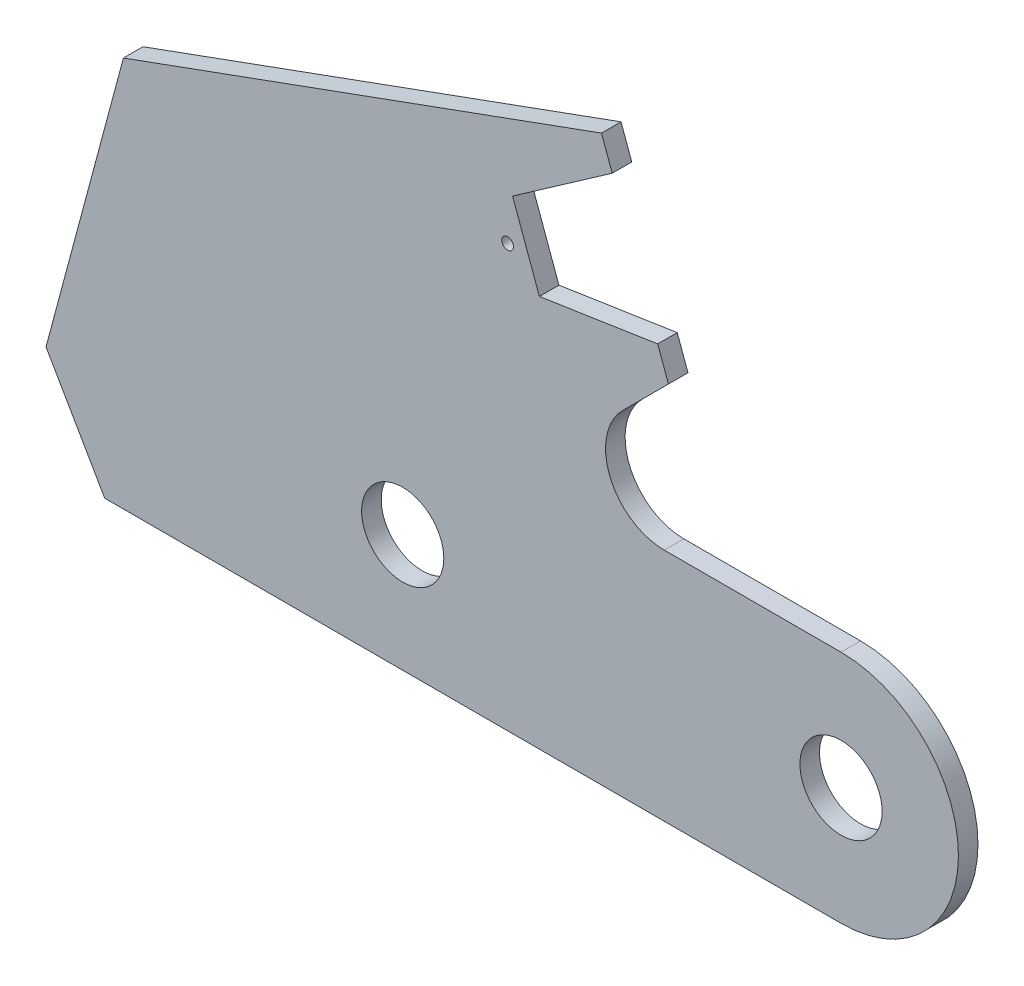
ISO-10303-21;
HEADER;
FILE_DESCRIPTION(('STEP AP214'),'2;1');
FILE_NAME('part.step','',(''),(''),'','','');
FILE_SCHEMA(('AUTOMOTIVE_DESIGN { 1 0 10303 214 1 1 1 1 }'));
ENDSEC;
DATA;
#1=APPLICATION_CONTEXT('core data for automotive mechanical design processes');
#2=APPLICATION_PROTOCOL_DEFINITION('international standard','automotive_design',2000,#1);
#3=PRODUCT_CONTEXT('',#1,'mechanical');
#4=PRODUCT('Part','Part','',(#3));
#5=PRODUCT_RELATED_PRODUCT_CATEGORY('part','',(#4));
#6=PRODUCT_DEFINITION_FORMATION('','',#4);
#7=PRODUCT_DEFINITION_CONTEXT('part definition',#1,'design');
#8=PRODUCT_DEFINITION('design','',#6,#7);
#9=PRODUCT_DEFINITION_SHAPE('','',#8);
#10=(LENGTH_UNIT() NAMED_UNIT(*) SI_UNIT(.MILLI.,.METRE.));
#11=(NAMED_UNIT(*) PLANE_ANGLE_UNIT() SI_UNIT($,.RADIAN.));
#12=(NAMED_UNIT(*) SI_UNIT($,.STERADIAN.) SOLID_ANGLE_UNIT());
#13=UNCERTAINTY_MEASURE_WITH_UNIT(LENGTH_MEASURE(1.E-05),#10,'distance_accuracy_value','');
#14=(GEOMETRIC_REPRESENTATION_CONTEXT(3) GLOBAL_UNCERTAINTY_ASSIGNED_CONTEXT((#13)) GLOBAL_UNIT_ASSIGNED_CONTEXT((#10,
#11,#12)) REPRESENTATION_CONTEXT('',''));
#15=CARTESIAN_POINT('',(0.,0.,0.));
#16=DIRECTION('',(0.,0.,1.));
#17=DIRECTION('',(1.,0.,0.));
#18=AXIS2_PLACEMENT_3D('',#15,#16,#17);
#19=CARTESIAN_POINT('',(33.0953869903001,191.493652480747,5.));
#20=DIRECTION('',(-0.93969262078591,-0.342020143325664,0.));
#21=DIRECTION('',(0.342020143325664,-0.93969262078591,0.));
#22=AXIS2_PLACEMENT_3D('',#19,#20,#21);
#23=PLANE('',#22);
#24=DIRECTION('',(-0.342020143325664,0.93969262078591,0.));
#25=VECTOR('',#24,1.);
#26=CARTESIAN_POINT('',(33.0953869903001,191.493652480747,0.));
#27=LINE('',#26,#25);
#28=CARTESIAN_POINT('',(50.1963941565833,144.509021441452,0.));
#29=VERTEX_POINT('',#28);
#30=CARTESIAN_POINT('',(47.460233009978,152.026562407739,0.));
#31=VERTEX_POINT('',#30);
#32=EDGE_CURVE('E239',#29,#31,#27,.T.);
#33=ORIENTED_EDGE('',*,*,#32,.T.);
#34=DIRECTION('',(0.,0.,1.));
#35=VECTOR('',#34,1.);
#36=CARTESIAN_POINT('',(47.460233009978,152.026562407739,0.));
#37=LINE('',#36,#35);
#38=CARTESIAN_POINT('',(47.460233009978,152.026562407739,5.));
#39=VERTEX_POINT('',#38);
#40=EDGE_CURVE('E176',#31,#39,#37,.T.);
#41=ORIENTED_EDGE('',*,*,#40,.T.);
#42=DIRECTION('',(-0.342020143325664,0.93969262078591,0.));
#43=VECTOR('',#42,1.);
#44=CARTESIAN_POINT('',(33.0953869903001,191.493652480747,5.));
#45=LINE('',#44,#43);
#46=CARTESIAN_POINT('',(50.1963941565833,144.509021441452,5.));
#47=VERTEX_POINT('',#46);
#48=EDGE_CURVE('E213',#47,#39,#45,.T.);
#49=ORIENTED_EDGE('',*,*,#48,.F.);
#50=DIRECTION('',(0.,0.,-1.));
#51=VECTOR('',#50,1.);
#52=CARTESIAN_POINT('',(50.1963941565833,144.509021441452,5.));
#53=LINE('',#52,#51);
#54=EDGE_CURVE('E273',#47,#29,#53,.T.);
#55=ORIENTED_EDGE('',*,*,#54,.T.);
#56=EDGE_LOOP('',(#33,#41,#49,#55));
#57=FACE_BOUND('',#56,.T.);
#58=ADVANCED_FACE('F39',(#57),#23,.F.);
#59=CARTESIAN_POINT('',(94.3012720118339,77.230107029859,5.));
#60=DIRECTION('',(0.,0.,1.));
#61=DIRECTION('',(1.,0.,0.));
#62=AXIS2_PLACEMENT_3D('',#59,#60,#61);
#63=PLANE('',#62);
#64=CARTESIAN_POINT('',(9.09866898926051,155.090939323916,5.));
#65=DIRECTION('',(0.,0.,1.));
#66=DIRECTION('',(1.,0.,0.));
#67=AXIS2_PLACEMENT_3D('',#64,#65,#66);
#68=CIRCLE('',#67,1.5);
#69=CARTESIAN_POINT('',(10.5986689892605,155.090939323916,5.));
#70=VERTEX_POINT('',#69);
#71=EDGE_CURVE('E166',#70,#70,#68,.T.);
#72=ORIENTED_EDGE('',*,*,#71,.F.);
#73=EDGE_LOOP('',(#72));
#74=FACE_BOUND('',#73,.T.);
#75=DIRECTION('',(0.988520093680456,0.151089458235781,0.));
#76=VECTOR('',#75,1.);
#77=CARTESIAN_POINT('',(17.2173335264467,147.404113832685,5.));
#78=LINE('',#77,#76);
#79=CARTESIAN_POINT('',(17.2173335264467,147.404113832685,5.));
#80=VERTEX_POINT('',#79);
#81=EDGE_CURVE('E160',#80,#39,#78,.T.);
#82=ORIENTED_EDGE('',*,*,#81,.F.);
#83=DIRECTION('',(0.342020143325664,-0.93969262078591,0.));
#84=VECTOR('',#83,1.);
#85=CARTESIAN_POINT('',(10.3769306599334,166.197966248403,5.));
#86=LINE('',#85,#84);
#87=CARTESIAN_POINT('',(10.3769306599334,166.197966248403,5.));
#88=VERTEX_POINT('',#87);
#89=EDGE_CURVE('E163',#88,#80,#86,.T.);
#90=ORIENTED_EDGE('',*,*,#89,.F.);
#91=DIRECTION('',(-0.819838026014496,-0.572595503912365,0.));
#92=VECTOR('',#91,1.);
#93=CARTESIAN_POINT('',(35.8315481369054,183.97611151446,5.));
#94=LINE('',#93,#92);
#95=CARTESIAN_POINT('',(35.8315481369054,183.97611151446,5.));
#96=VERTEX_POINT('',#95);
#97=EDGE_CURVE('E137',#96,#88,#94,.T.);
#98=ORIENTED_EDGE('',*,*,#97,.F.);
#99=CARTESIAN_POINT('',(33.0953869903001,191.493652480747,5.));
#100=VERTEX_POINT('',#99);
#101=EDGE_CURVE('E212',#96,#100,#45,.T.);
#102=ORIENTED_EDGE('',*,*,#101,.T.);
#103=DIRECTION('',(-0.93969262078591,-0.342020143325664,0.));
#104=VECTOR('',#103,1.);
#105=CARTESIAN_POINT('',(-89.0646537118682,147.031033848411,5.));
#106=LINE('',#105,#104);
#107=CARTESIAN_POINT('',(-89.0646537118682,147.031033848411,5.));
#108=VERTEX_POINT('',#107);
#109=EDGE_CURVE('E217',#100,#108,#106,.T.);
#110=ORIENTED_EDGE('',*,*,#109,.T.);
#111=DIRECTION('',(-0.258819045102524,-0.965925826289067,0.));
#112=VECTOR('',#111,1.);
#113=CARTESIAN_POINT('',(-108.844707229711,73.2108691433922,5.));
#114=LINE('',#113,#112);
#115=CARTESIAN_POINT('',(-108.844707229711,73.2108691433922,5.));
#116=VERTEX_POINT('',#115);
#117=EDGE_CURVE('E220',#108,#116,#114,.T.);
#118=ORIENTED_EDGE('',*,*,#117,.T.);
#119=DIRECTION('',(0.499999999999998,-0.86602540378444,0.));
#120=VECTOR('',#119,1.);
#121=CARTESIAN_POINT('',(-93.8447072297108,47.230107029859,5.));
#122=LINE('',#121,#120);
#123=CARTESIAN_POINT('',(-93.8447072297108,47.230107029859,5.));
#124=VERTEX_POINT('',#123);
#125=EDGE_CURVE('E223',#116,#124,#122,.T.);
#126=ORIENTED_EDGE('',*,*,#125,.T.);
#127=DIRECTION('',(1.,0.,0.));
#128=VECTOR('',#127,1.);
#129=CARTESIAN_POINT('',(94.3012720118339,47.230107029859,5.));
#130=LINE('',#129,#128);
#131=CARTESIAN_POINT('',(94.3012720118339,47.230107029859,5.));
#132=VERTEX_POINT('',#131);
#133=EDGE_CURVE('E226',#124,#132,#130,.T.);
#134=ORIENTED_EDGE('',*,*,#133,.T.);
#135=CARTESIAN_POINT('',(94.3012720118339,77.230107029859,5.));
#136=DIRECTION('',(0.,0.,1.));
#137=DIRECTION('',(1.,0.,0.));
#138=AXIS2_PLACEMENT_3D('',#135,#136,#137);
#139=CIRCLE('',#138,30.);
#140=CARTESIAN_POINT('',(94.3012720118339,107.230107029859,5.));
#141=VERTEX_POINT('',#140);
#142=EDGE_CURVE('E201',#132,#141,#139,.T.);
#143=ORIENTED_EDGE('',*,*,#142,.T.);
#144=DIRECTION('',(-1.,0.,0.));
#145=VECTOR('',#144,1.);
#146=CARTESIAN_POINT('',(94.3012720118339,107.230107029859,5.));
#147=LINE('',#146,#145);
#148=CARTESIAN_POINT('',(49.1306831805869,107.230107029859,5.));
#149=VERTEX_POINT('',#148);
#150=EDGE_CURVE('E205',#141,#149,#147,.T.);
#151=ORIENTED_EDGE('',*,*,#150,.T.);
#152=CARTESIAN_POINT('',(49.1306831805869,122.230107029859,5.));
#153=DIRECTION('',(0.,0.,1.));
#154=DIRECTION('',(1.,0.,0.));
#155=AXIS2_PLACEMENT_3D('',#152,#153,#154);
#156=CIRCLE('',#155,15.);
#157=CARTESIAN_POINT('',(38.5240814627887,132.836708747657,5.));
#158=VERTEX_POINT('',#157);
#159=EDGE_CURVE('E11',#149,#158,#156,.F.);
#160=ORIENTED_EDGE('',*,*,#159,.T.);
#161=DIRECTION('',(0.707106781186546,0.707106781186549,0.));
#162=VECTOR('',#161,1.);
#163=CARTESIAN_POINT('',(50.1963941565833,144.509021441452,5.));
#164=LINE('',#163,#162);
#165=EDGE_CURVE('E209',#158,#47,#164,.T.);
#166=ORIENTED_EDGE('',*,*,#165,.T.);
#167=ORIENTED_EDGE('',*,*,#48,.T.);
#168=EDGE_LOOP('',(#82,#90,#98,#102,#110,#118,#126,#134,#143,#151,#160,#166,#167));
#169=FACE_BOUND('',#168,.T.);
#170=CARTESIAN_POINT('',(-17.6987279881661,77.230107029859,5.));
#171=DIRECTION('',(0.,0.,1.));
#172=DIRECTION('',(1.,0.,0.));
#173=AXIS2_PLACEMENT_3D('',#170,#171,#172);
#174=CIRCLE('',#173,10.5);
#175=CARTESIAN_POINT('',(-7.19872798816611,77.230107029859,5.));
#176=VERTEX_POINT('',#175);
#177=EDGE_CURVE('E193',#176,#176,#174,.T.);
#178=ORIENTED_EDGE('',*,*,#177,.F.);
#179=EDGE_LOOP('',(#178));
#180=FACE_BOUND('',#179,.T.);
#181=CARTESIAN_POINT('',(94.3012720118339,77.230107029859,5.));
#182=DIRECTION('',(0.,0.,1.));
#183=DIRECTION('',(1.,0.,0.));
#184=AXIS2_PLACEMENT_3D('',#181,#182,#183);
#185=CIRCLE('',#184,10.5);
#186=CARTESIAN_POINT('',(104.801272011834,77.230107029859,5.));
#187=VERTEX_POINT('',#186);
#188=EDGE_CURVE('E185',#187,#187,#185,.T.);
#189=ORIENTED_EDGE('',*,*,#188,.F.);
#190=EDGE_LOOP('',(#189));
#191=FACE_BOUND('',#190,.T.);
#192=ADVANCED_FACE('F298',(#74,#169,#180,#191),#63,.T.);
#193=CARTESIAN_POINT('',(94.3012720118339,77.230107029859,0.));
#194=DIRECTION('',(0.,0.,1.));
#195=DIRECTION('',(1.,0.,0.));
#196=AXIS2_PLACEMENT_3D('',#193,#194,#195);
#197=PLANE('',#196);
#198=CARTESIAN_POINT('',(9.09866898926051,155.090939323916,0.));
#199=DIRECTION('',(0.,0.,1.));
#200=DIRECTION('',(1.,0.,0.));
#201=AXIS2_PLACEMENT_3D('',#198,#199,#200);
#202=CIRCLE('',#201,1.5);
#203=CARTESIAN_POINT('',(10.5986689892605,155.090939323916,0.));
#204=VERTEX_POINT('',#203);
#205=EDGE_CURVE('E173',#204,#204,#202,.T.);
#206=ORIENTED_EDGE('',*,*,#205,.T.);
#207=EDGE_LOOP('',(#206));
#208=FACE_BOUND('',#207,.T.);
#209=DIRECTION('',(0.342020143325664,-0.93969262078591,0.));
#210=VECTOR('',#209,1.);
#211=CARTESIAN_POINT('',(10.3769306599334,166.197966248403,0.));
#212=LINE('',#211,#210);
#213=CARTESIAN_POINT('',(10.3769306599334,166.197966248403,0.));
#214=VERTEX_POINT('',#213);
#215=CARTESIAN_POINT('',(17.2173335264467,147.404113832685,0.));
#216=VERTEX_POINT('',#215);
#217=EDGE_CURVE('E146',#214,#216,#212,.T.);
#218=ORIENTED_EDGE('',*,*,#217,.T.);
#219=DIRECTION('',(0.988520093680456,0.151089458235781,0.));
#220=VECTOR('',#219,1.);
#221=CARTESIAN_POINT('',(17.2173335264467,147.404113832685,0.));
#222=LINE('',#221,#220);
#223=EDGE_CURVE('E152',#216,#31,#222,.T.);
#224=ORIENTED_EDGE('',*,*,#223,.T.);
#225=ORIENTED_EDGE('',*,*,#32,.F.);
#226=DIRECTION('',(0.707106781186546,0.707106781186549,0.));
#227=VECTOR('',#226,1.);
#228=CARTESIAN_POINT('',(50.1963941565833,144.509021441452,0.));
#229=LINE('',#228,#227);
#230=CARTESIAN_POINT('',(38.5240814627887,132.836708747657,0.));
#231=VERTEX_POINT('',#230);
#232=EDGE_CURVE('E236',#231,#29,#229,.T.);
#233=ORIENTED_EDGE('',*,*,#232,.F.);
#234=CARTESIAN_POINT('',(49.1306831805869,122.230107029859,0.));
#235=DIRECTION('',(0.,0.,1.));
#236=DIRECTION('',(1.,0.,0.));
#237=AXIS2_PLACEMENT_3D('',#234,#235,#236);
#238=CIRCLE('',#237,15.);
#239=CARTESIAN_POINT('',(49.1306831805869,107.230107029859,0.));
#240=VERTEX_POINT('',#239);
#241=EDGE_CURVE('E48',#231,#240,#238,.T.);
#242=ORIENTED_EDGE('',*,*,#241,.T.);
#243=DIRECTION('',(-1.,0.,0.));
#244=VECTOR('',#243,1.);
#245=CARTESIAN_POINT('',(94.3012720118339,107.230107029859,0.));
#246=LINE('',#245,#244);
#247=CARTESIAN_POINT('',(94.3012720118339,107.230107029859,0.));
#248=VERTEX_POINT('',#247);
#249=EDGE_CURVE('E233',#248,#240,#246,.T.);
#250=ORIENTED_EDGE('',*,*,#249,.F.);
#251=CARTESIAN_POINT('',(94.3012720118339,77.230107029859,0.));
#252=DIRECTION('',(0.,0.,1.));
#253=DIRECTION('',(1.,0.,0.));
#254=AXIS2_PLACEMENT_3D('',#251,#252,#253);
#255=CIRCLE('',#254,30.);
#256=CARTESIAN_POINT('',(94.3012720118339,47.230107029859,0.));
#257=VERTEX_POINT('',#256);
#258=EDGE_CURVE('E197',#257,#248,#255,.T.);
#259=ORIENTED_EDGE('',*,*,#258,.F.);
#260=DIRECTION('',(1.,0.,0.));
#261=VECTOR('',#260,1.);
#262=CARTESIAN_POINT('',(94.3012720118339,47.230107029859,0.));
#263=LINE('',#262,#261);
#264=CARTESIAN_POINT('',(-93.8447072297108,47.230107029859,0.));
#265=VERTEX_POINT('',#264);
#266=EDGE_CURVE('E206',#265,#257,#263,.T.);
#267=ORIENTED_EDGE('',*,*,#266,.F.);
#268=DIRECTION('',(0.499999999999998,-0.86602540378444,0.));
#269=VECTOR('',#268,1.);
#270=CARTESIAN_POINT('',(-93.8447072297108,47.230107029859,0.));
#271=LINE('',#270,#269);
#272=CARTESIAN_POINT('',(-108.844707229711,73.2108691433922,0.));
#273=VERTEX_POINT('',#272);
#274=EDGE_CURVE('E249',#273,#265,#271,.T.);
#275=ORIENTED_EDGE('',*,*,#274,.F.);
#276=DIRECTION('',(-0.258819045102524,-0.965925826289067,0.));
#277=VECTOR('',#276,1.);
#278=CARTESIAN_POINT('',(-108.844707229711,73.2108691433922,0.));
#279=LINE('',#278,#277);
#280=CARTESIAN_POINT('',(-89.0646537118682,147.031033848411,0.));
#281=VERTEX_POINT('',#280);
#282=EDGE_CURVE('E246',#281,#273,#279,.T.);
#283=ORIENTED_EDGE('',*,*,#282,.F.);
#284=DIRECTION('',(-0.93969262078591,-0.342020143325664,0.));
#285=VECTOR('',#284,1.);
#286=CARTESIAN_POINT('',(-89.0646537118682,147.031033848411,0.));
#287=LINE('',#286,#285);
#288=CARTESIAN_POINT('',(33.0953869903001,191.493652480747,0.));
#289=VERTEX_POINT('',#288);
#290=EDGE_CURVE('E243',#289,#281,#287,.T.);
#291=ORIENTED_EDGE('',*,*,#290,.F.);
#292=CARTESIAN_POINT('',(35.8315481369054,183.97611151446,0.));
#293=VERTEX_POINT('',#292);
#294=EDGE_CURVE('E158',#293,#289,#27,.T.);
#295=ORIENTED_EDGE('',*,*,#294,.F.);
#296=DIRECTION('',(-0.819838026014496,-0.572595503912365,0.));
#297=VECTOR('',#296,1.);
#298=CARTESIAN_POINT('',(35.8315481369054,183.97611151446,0.));
#299=LINE('',#298,#297);
#300=EDGE_CURVE('E55',#293,#214,#299,.T.);
#301=ORIENTED_EDGE('',*,*,#300,.T.);
#302=EDGE_LOOP('',(#218,#224,#225,#233,#242,#250,#259,#267,#275,#283,#291,#295,#301));
#303=FACE_BOUND('',#302,.T.);
#304=CARTESIAN_POINT('',(-17.6987279881661,77.230107029859,0.));
#305=DIRECTION('',(0.,0.,1.));
#306=DIRECTION('',(1.,0.,0.));
#307=AXIS2_PLACEMENT_3D('',#304,#305,#306);
#308=CIRCLE('',#307,10.5);
#309=CARTESIAN_POINT('',(-7.19872798816611,77.230107029859,0.));
#310=VERTEX_POINT('',#309);
#311=EDGE_CURVE('E189',#310,#310,#308,.T.);
#312=ORIENTED_EDGE('',*,*,#311,.T.);
#313=EDGE_LOOP('',(#312));
#314=FACE_BOUND('',#313,.T.);
#315=CARTESIAN_POINT('',(94.3012720118339,77.230107029859,0.));
#316=DIRECTION('',(0.,0.,1.));
#317=DIRECTION('',(1.,0.,0.));
#318=AXIS2_PLACEMENT_3D('',#315,#316,#317);
#319=CIRCLE('',#318,10.5);
#320=CARTESIAN_POINT('',(104.801272011834,77.230107029859,0.));
#321=VERTEX_POINT('',#320);
#322=EDGE_CURVE('E180',#321,#321,#319,.T.);
#323=ORIENTED_EDGE('',*,*,#322,.T.);
#324=EDGE_LOOP('',(#323));
#325=FACE_BOUND('',#324,.T.);
#326=ADVANCED_FACE('F155',(#208,#303,#314,#325),#197,.F.);
#327=CARTESIAN_POINT('',(94.3012720118339,77.230107029859,5.));
#328=DIRECTION('',(0.,0.,-1.));
#329=DIRECTION('',(-1.,0.,0.));
#330=AXIS2_PLACEMENT_3D('',#327,#328,#329);
#331=CYLINDRICAL_SURFACE('',#330,30.);
#332=ORIENTED_EDGE('',*,*,#258,.T.);
#333=DIRECTION('',(0.,0.,-1.));
#334=VECTOR('',#333,1.);
#335=CARTESIAN_POINT('',(94.3012720118339,107.230107029859,5.));
#336=LINE('',#335,#334);
#337=EDGE_CURVE('E277',#141,#248,#336,.T.);
#338=ORIENTED_EDGE('',*,*,#337,.F.);
#339=ORIENTED_EDGE('',*,*,#142,.F.);
#340=DIRECTION('',(0.,0.,-1.));
#341=VECTOR('',#340,1.);
#342=CARTESIAN_POINT('',(94.3012720118339,47.230107029859,5.));
#343=LINE('',#342,#341);
#344=EDGE_CURVE('E229',#132,#257,#343,.T.);
#345=ORIENTED_EDGE('',*,*,#344,.T.);
#346=EDGE_LOOP('',(#332,#338,#339,#345));
#347=FACE_BOUND('',#346,.T.);
#348=ADVANCED_FACE('F357',(#347),#331,.T.);
#349=CARTESIAN_POINT('',(94.3012720118339,107.230107029859,5.));
#350=DIRECTION('',(0.,-1.,0.));
#351=DIRECTION('',(1.,0.,0.));
#352=AXIS2_PLACEMENT_3D('',#349,#350,#351);
#353=PLANE('',#352);
#354=ORIENTED_EDGE('',*,*,#249,.T.);
#355=DIRECTION('',(0.,0.,-1.));
#356=VECTOR('',#355,1.);
#357=CARTESIAN_POINT('',(49.1306831805869,107.230107029859,5.));
#358=LINE('',#357,#356);
#359=EDGE_CURVE('E63',#240,#149,#358,.F.);
#360=ORIENTED_EDGE('',*,*,#359,.T.);
#361=ORIENTED_EDGE('',*,*,#150,.F.);
#362=ORIENTED_EDGE('',*,*,#337,.T.);
#363=EDGE_LOOP('',(#354,#360,#361,#362));
#364=FACE_BOUND('',#363,.T.);
#365=ADVANCED_FACE('F292',(#364),#353,.F.);
#366=CARTESIAN_POINT('',(50.1963941565833,144.509021441452,5.));
#367=DIRECTION('',(-0.707106781186549,0.707106781186546,0.));
#368=DIRECTION('',(-0.707106781186546,-0.707106781186549,0.));
#369=AXIS2_PLACEMENT_3D('',#366,#367,#368);
#370=PLANE('',#369);
#371=ORIENTED_EDGE('',*,*,#165,.F.);
#372=DIRECTION('',(0.,0.,-1.));
#373=VECTOR('',#372,1.);
#374=CARTESIAN_POINT('',(38.5240814627887,132.836708747657,0.));
#375=LINE('',#374,#373);
#376=EDGE_CURVE('E281',#158,#231,#375,.T.);
#377=ORIENTED_EDGE('',*,*,#376,.T.);
#378=ORIENTED_EDGE('',*,*,#232,.T.);
#379=ORIENTED_EDGE('',*,*,#54,.F.);
#380=EDGE_LOOP('',(#371,#377,#378,#379));
#381=FACE_BOUND('',#380,.T.);
#382=ADVANCED_FACE('F302',(#381),#370,.F.);
#383=ORIENTED_EDGE('',*,*,#101,.F.);
#384=DIRECTION('',(0.,0.,1.));
#385=VECTOR('',#384,1.);
#386=CARTESIAN_POINT('',(35.8315481369054,183.97611151446,0.));
#387=LINE('',#386,#385);
#388=EDGE_CURVE('E143',#293,#96,#387,.T.);
#389=ORIENTED_EDGE('',*,*,#388,.F.);
#390=ORIENTED_EDGE('',*,*,#294,.T.);
#391=DIRECTION('',(0.,0.,-1.));
#392=VECTOR('',#391,1.);
#393=CARTESIAN_POINT('',(33.0953869903001,191.493652480747,5.));
#394=LINE('',#393,#392);
#395=EDGE_CURVE('E269',#100,#289,#394,.T.);
#396=ORIENTED_EDGE('',*,*,#395,.F.);
#397=EDGE_LOOP('',(#383,#389,#390,#396));
#398=FACE_BOUND('',#397,.T.);
#399=ADVANCED_FACE('F318',(#398),#23,.F.);
#400=CARTESIAN_POINT('',(-89.0646537118682,147.031033848411,5.));
#401=DIRECTION('',(0.342020143325664,-0.93969262078591,0.));
#402=DIRECTION('',(0.93969262078591,0.342020143325664,0.));
#403=AXIS2_PLACEMENT_3D('',#400,#401,#402);
#404=PLANE('',#403);
#405=ORIENTED_EDGE('',*,*,#290,.T.);
#406=DIRECTION('',(0.,0.,-1.));
#407=VECTOR('',#406,1.);
#408=CARTESIAN_POINT('',(-89.0646537118682,147.031033848411,5.));
#409=LINE('',#408,#407);
#410=EDGE_CURVE('E265',#108,#281,#409,.T.);
#411=ORIENTED_EDGE('',*,*,#410,.F.);
#412=ORIENTED_EDGE('',*,*,#109,.F.);
#413=ORIENTED_EDGE('',*,*,#395,.T.);
#414=EDGE_LOOP('',(#405,#411,#412,#413));
#415=FACE_BOUND('',#414,.T.);
#416=ADVANCED_FACE('F327',(#415),#404,.F.);
#417=CARTESIAN_POINT('',(-108.844707229711,73.2108691433922,5.));
#418=DIRECTION('',(0.965925826289067,-0.258819045102524,0.));
#419=DIRECTION('',(0.258819045102524,0.965925826289068,0.));
#420=AXIS2_PLACEMENT_3D('',#417,#418,#419);
#421=PLANE('',#420);
#422=ORIENTED_EDGE('',*,*,#282,.T.);
#423=DIRECTION('',(0.,0.,-1.));
#424=VECTOR('',#423,1.);
#425=CARTESIAN_POINT('',(-108.844707229711,73.2108691433922,5.));
#426=LINE('',#425,#424);
#427=EDGE_CURVE('E261',#116,#273,#426,.T.);
#428=ORIENTED_EDGE('',*,*,#427,.F.);
#429=ORIENTED_EDGE('',*,*,#117,.F.);
#430=ORIENTED_EDGE('',*,*,#410,.T.);
#431=EDGE_LOOP('',(#422,#428,#429,#430));
#432=FACE_BOUND('',#431,.T.);
#433=ADVANCED_FACE('F333',(#432),#421,.F.);
#434=CARTESIAN_POINT('',(-93.8447072297108,47.230107029859,5.));
#435=DIRECTION('',(0.86602540378444,0.499999999999998,0.));
#436=DIRECTION('',(-0.499999999999998,0.86602540378444,0.));
#437=AXIS2_PLACEMENT_3D('',#434,#435,#436);
#438=PLANE('',#437);
#439=ORIENTED_EDGE('',*,*,#274,.T.);
#440=DIRECTION('',(0.,0.,-1.));
#441=VECTOR('',#440,1.);
#442=CARTESIAN_POINT('',(-93.8447072297108,47.230107029859,5.));
#443=LINE('',#442,#441);
#444=EDGE_CURVE('E257',#124,#265,#443,.T.);
#445=ORIENTED_EDGE('',*,*,#444,.F.);
#446=ORIENTED_EDGE('',*,*,#125,.F.);
#447=ORIENTED_EDGE('',*,*,#427,.T.);
#448=EDGE_LOOP('',(#439,#445,#446,#447));
#449=FACE_BOUND('',#448,.T.);
#450=ADVANCED_FACE('F349',(#449),#438,.F.);
#451=CARTESIAN_POINT('',(94.3012720118339,47.230107029859,5.));
#452=DIRECTION('',(0.,1.,0.));
#453=DIRECTION('',(-1.,0.,0.));
#454=AXIS2_PLACEMENT_3D('',#451,#452,#453);
#455=PLANE('',#454);
#456=ORIENTED_EDGE('',*,*,#266,.T.);
#457=ORIENTED_EDGE('',*,*,#344,.F.);
#458=ORIENTED_EDGE('',*,*,#133,.F.);
#459=ORIENTED_EDGE('',*,*,#444,.T.);
#460=EDGE_LOOP('',(#456,#457,#458,#459));
#461=FACE_BOUND('',#460,.T.);
#462=ADVANCED_FACE('F355',(#461),#455,.F.);
#463=CARTESIAN_POINT('',(-17.6987279881661,77.230107029859,5.));
#464=DIRECTION('',(0.,0.,-1.));
#465=DIRECTION('',(-1.,0.,0.));
#466=AXIS2_PLACEMENT_3D('',#463,#464,#465);
#467=CYLINDRICAL_SURFACE('',#466,10.5);
#468=ORIENTED_EDGE('',*,*,#177,.T.);
#469=EDGE_LOOP('',(#468));
#470=FACE_BOUND('',#469,.T.);
#471=ORIENTED_EDGE('',*,*,#311,.F.);
#472=EDGE_LOOP('',(#471));
#473=FACE_BOUND('',#472,.T.);
#474=ADVANCED_FACE('F373',(#470,#473),#467,.F.);
#475=CARTESIAN_POINT('',(94.3012720118339,77.230107029859,5.));
#476=DIRECTION('',(0.,0.,-1.));
#477=DIRECTION('',(-1.,0.,0.));
#478=AXIS2_PLACEMENT_3D('',#475,#476,#477);
#479=CYLINDRICAL_SURFACE('',#478,10.5);
#480=ORIENTED_EDGE('',*,*,#188,.T.);
#481=EDGE_LOOP('',(#480));
#482=FACE_BOUND('',#481,.T.);
#483=ORIENTED_EDGE('',*,*,#322,.F.);
#484=EDGE_LOOP('',(#483));
#485=FACE_BOUND('',#484,.T.);
#486=ADVANCED_FACE('F314',(#482,#485),#479,.F.);
#487=CARTESIAN_POINT('',(49.1306831805869,122.230107029859,5.));
#488=DIRECTION('',(0.,0.,1.));
#489=DIRECTION('',(1.,0.,0.));
#490=AXIS2_PLACEMENT_3D('',#487,#488,#489);
#491=CYLINDRICAL_SURFACE('',#490,15.);
#492=ORIENTED_EDGE('',*,*,#159,.F.);
#493=ORIENTED_EDGE('',*,*,#359,.F.);
#494=ORIENTED_EDGE('',*,*,#241,.F.);
#495=ORIENTED_EDGE('',*,*,#376,.F.);
#496=EDGE_LOOP('',(#492,#493,#494,#495));
#497=FACE_BOUND('',#496,.T.);
#498=ADVANCED_FACE('F41',(#497),#491,.F.);
#499=CARTESIAN_POINT('',(17.2173335264467,147.404113832685,0.));
#500=DIRECTION('',(0.151089458235781,-0.988520093680456,0.));
#501=DIRECTION('',(0.988520093680456,0.151089458235781,0.));
#502=AXIS2_PLACEMENT_3D('',#499,#500,#501);
#503=PLANE('',#502);
#504=ORIENTED_EDGE('',*,*,#81,.T.);
#505=ORIENTED_EDGE('',*,*,#40,.F.);
#506=ORIENTED_EDGE('',*,*,#223,.F.);
#507=DIRECTION('',(0.,0.,1.));
#508=VECTOR('',#507,1.);
#509=CARTESIAN_POINT('',(17.2173335264467,147.404113832685,0.));
#510=LINE('',#509,#508);
#511=EDGE_CURVE('E142',#216,#80,#510,.T.);
#512=ORIENTED_EDGE('',*,*,#511,.T.);
#513=EDGE_LOOP('',(#504,#505,#506,#512));
#514=FACE_BOUND('',#513,.T.);
#515=ADVANCED_FACE('F306',(#514),#503,.F.);
#516=CARTESIAN_POINT('',(10.3769306599334,166.197966248403,0.));
#517=DIRECTION('',(-0.93969262078591,-0.342020143325664,0.));
#518=DIRECTION('',(0.342020143325664,-0.93969262078591,0.));
#519=AXIS2_PLACEMENT_3D('',#516,#517,#518);
#520=PLANE('',#519);
#521=ORIENTED_EDGE('',*,*,#89,.T.);
#522=ORIENTED_EDGE('',*,*,#511,.F.);
#523=ORIENTED_EDGE('',*,*,#217,.F.);
#524=DIRECTION('',(0.,0.,1.));
#525=VECTOR('',#524,1.);
#526=CARTESIAN_POINT('',(10.3769306599334,166.197966248403,0.));
#527=LINE('',#526,#525);
#528=EDGE_CURVE('E133',#214,#88,#527,.T.);
#529=ORIENTED_EDGE('',*,*,#528,.T.);
#530=EDGE_LOOP('',(#521,#522,#523,#529));
#531=FACE_BOUND('',#530,.T.);
#532=ADVANCED_FACE('F147',(#531),#520,.F.);
#533=CARTESIAN_POINT('',(35.8315481369054,183.97611151446,0.));
#534=DIRECTION('',(-0.572595503912365,0.819838026014496,0.));
#535=DIRECTION('',(-0.819838026014496,-0.572595503912365,0.));
#536=AXIS2_PLACEMENT_3D('',#533,#534,#535);
#537=PLANE('',#536);
#538=ORIENTED_EDGE('',*,*,#97,.T.);
#539=ORIENTED_EDGE('',*,*,#528,.F.);
#540=ORIENTED_EDGE('',*,*,#300,.F.);
#541=ORIENTED_EDGE('',*,*,#388,.T.);
#542=EDGE_LOOP('',(#538,#539,#540,#541));
#543=FACE_BOUND('',#542,.T.);
#544=ADVANCED_FACE('F135',(#543),#537,.F.);
#545=CARTESIAN_POINT('',(9.09866898926051,155.090939323916,0.));
#546=DIRECTION('',(0.,0.,1.));
#547=DIRECTION('',(1.,0.,0.));
#548=AXIS2_PLACEMENT_3D('',#545,#546,#547);
#549=CYLINDRICAL_SURFACE('',#548,1.5);
#550=ORIENTED_EDGE('',*,*,#205,.F.);
#551=EDGE_LOOP('',(#550));
#552=FACE_BOUND('',#551,.T.);
#553=ORIENTED_EDGE('',*,*,#71,.T.);
#554=EDGE_LOOP('',(#553));
#555=FACE_BOUND('',#554,.T.);
#556=ADVANCED_FACE('F449',(#552,#555),#549,.F.);
#557=CLOSED_SHELL('',(#58,#192,#326,#348,#365,#382,#399,#416,#433,#450,#462,#474,#486,#498,#515,
#532,#544,#556));
#558=MANIFOLD_SOLID_BREP('B2',#557);
#559=ADVANCED_BREP_SHAPE_REPRESENTATION('',(#18,#558),#14);
#560=SHAPE_DEFINITION_REPRESENTATION(#9,#559);
ENDSEC;
END-ISO-10303-21;
